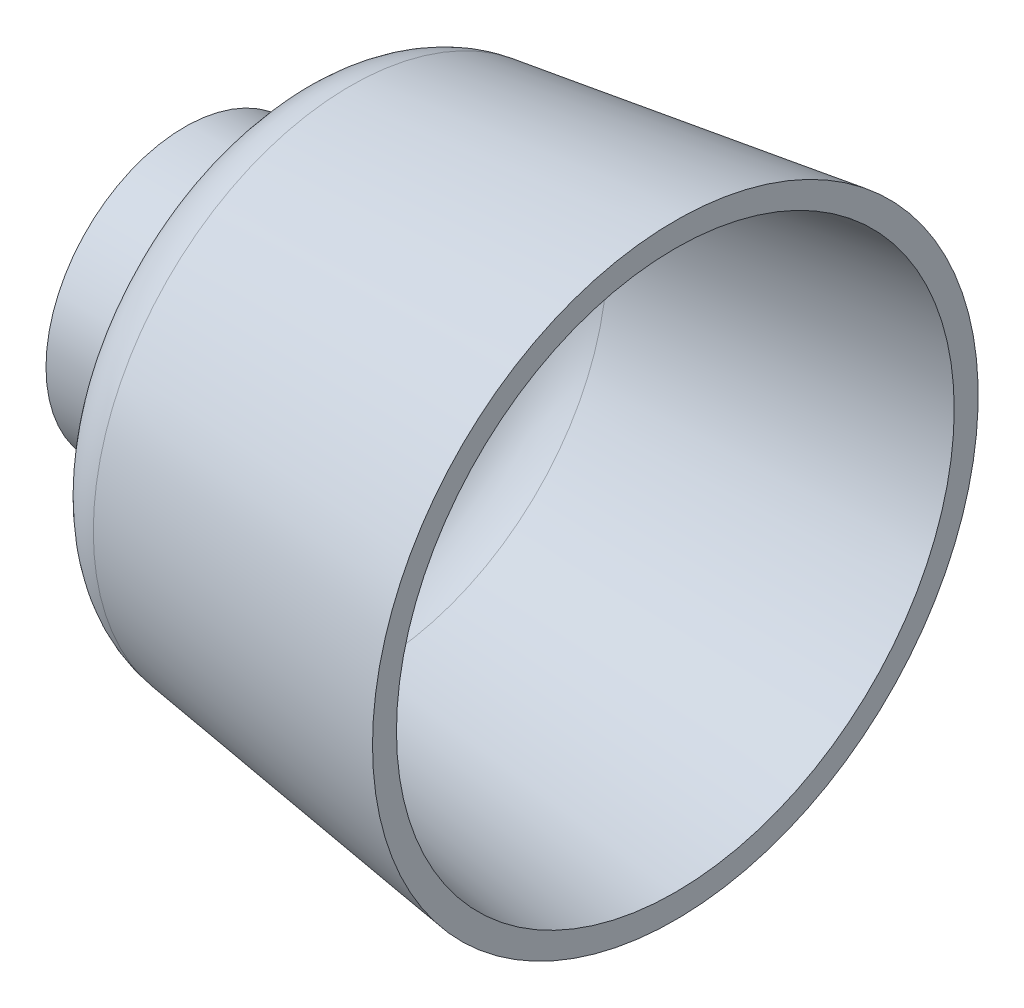
ISO-10303-21;
HEADER;
FILE_DESCRIPTION(('STEP AP214'),'2;1');
FILE_NAME('part.step','',(''),(''),'','','');
FILE_SCHEMA(('AUTOMOTIVE_DESIGN { 1 0 10303 214 1 1 1 1 }'));
ENDSEC;
DATA;
#1=APPLICATION_CONTEXT('core data for automotive mechanical design processes');
#2=APPLICATION_PROTOCOL_DEFINITION('international standard','automotive_design',2000,#1);
#3=PRODUCT_CONTEXT('',#1,'mechanical');
#4=PRODUCT('Part','Part','',(#3));
#5=PRODUCT_RELATED_PRODUCT_CATEGORY('part','',(#4));
#6=PRODUCT_DEFINITION_FORMATION('','',#4);
#7=PRODUCT_DEFINITION_CONTEXT('part definition',#1,'design');
#8=PRODUCT_DEFINITION('design','',#6,#7);
#9=PRODUCT_DEFINITION_SHAPE('','',#8);
#10=(LENGTH_UNIT() NAMED_UNIT(*) SI_UNIT(.MILLI.,.METRE.));
#11=(NAMED_UNIT(*) PLANE_ANGLE_UNIT() SI_UNIT($,.RADIAN.));
#12=(NAMED_UNIT(*) SI_UNIT($,.STERADIAN.) SOLID_ANGLE_UNIT());
#13=UNCERTAINTY_MEASURE_WITH_UNIT(LENGTH_MEASURE(1.E-05),#10,'distance_accuracy_value','');
#14=(GEOMETRIC_REPRESENTATION_CONTEXT(3) GLOBAL_UNCERTAINTY_ASSIGNED_CONTEXT((#13)) GLOBAL_UNIT_ASSIGNED_CONTEXT((#10,
#11,#12)) REPRESENTATION_CONTEXT('',''));
#15=CARTESIAN_POINT('',(0.,0.,0.));
#16=DIRECTION('',(0.,0.,1.));
#17=DIRECTION('',(1.,0.,0.));
#18=AXIS2_PLACEMENT_3D('',#15,#16,#17);
#19=CARTESIAN_POINT('',(7.68207066449393,0.,0.));
#20=DIRECTION('',(-1.,0.,0.));
#21=DIRECTION('',(0.,0.,1.));
#22=AXIS2_PLACEMENT_3D('',#19,#20,#21);
#23=PLANE('',#22);
#24=CARTESIAN_POINT('',(7.68207066449393,0.,0.));
#25=DIRECTION('',(-1.,0.,0.));
#26=DIRECTION('',(0.,0.,1.));
#27=AXIS2_PLACEMENT_3D('',#24,#25,#26);
#28=CIRCLE('',#27,7.34186999999999);
#29=CARTESIAN_POINT('',(7.68207066449393,0.,7.34186999999999));
#30=VERTEX_POINT('',#29);
#31=EDGE_CURVE('E69',#30,#30,#28,.T.);
#32=ORIENTED_EDGE('',*,*,#31,.T.);
#33=EDGE_LOOP('',(#32));
#34=FACE_BOUND('',#33,.T.);
#35=CARTESIAN_POINT('',(7.68207066449394,0.,0.));
#36=DIRECTION('',(-1.,0.,0.));
#37=DIRECTION('',(0.,0.,1.));
#38=AXIS2_PLACEMENT_3D('',#35,#36,#37);
#39=CIRCLE('',#38,7.68858);
#40=CARTESIAN_POINT('',(7.68207066449394,0.,7.68858));
#41=VERTEX_POINT('',#40);
#42=EDGE_CURVE('E54',#41,#41,#39,.T.);
#43=ORIENTED_EDGE('',*,*,#42,.F.);
#44=EDGE_LOOP('',(#43));
#45=FACE_BOUND('',#44,.T.);
#46=ADVANCED_FACE('F34',(#34,#45),#23,.F.);
#47=CARTESIAN_POINT('',(7.68207066449394,0.,0.));
#48=DIRECTION('',(1.,0.,0.));
#49=DIRECTION('',(0.,0.,-1.));
#50=AXIS2_PLACEMENT_3D('',#47,#48,#49);
#51=CONICAL_SURFACE('',#50,7.68858,1.39626340159547);
#52=CARTESIAN_POINT('',(8.42483198923574,0.,0.));
#53=DIRECTION('',(1.,0.,0.));
#54=DIRECTION('',(0.,0.,-1.));
#55=AXIS2_PLACEMENT_3D('',#52,#53,#54);
#56=CIRCLE('',#55,11.9009887973234);
#57=CARTESIAN_POINT('',(8.42483198923574,0.,-11.9009887973234));
#58=VERTEX_POINT('',#57);
#59=EDGE_CURVE('E45',#58,#58,#56,.T.);
#60=ORIENTED_EDGE('',*,*,#59,.T.);
#61=EDGE_LOOP('',(#60));
#62=FACE_BOUND('',#61,.T.);
#63=ORIENTED_EDGE('',*,*,#42,.T.);
#64=EDGE_LOOP('',(#63));
#65=FACE_BOUND('',#64,.T.);
#66=ADVANCED_FACE('F101',(#62,#65),#51,.F.);
#67=CARTESIAN_POINT('',(9.02568225749241,0.,0.));
#68=DIRECTION('',(1.,0.,0.));
#69=DIRECTION('',(0.,0.,-1.));
#70=AXIS2_PLACEMENT_3D('',#67,#68,#69);
#71=CONICAL_SURFACE('',#70,15.30858,0.139626340159547);
#72=CARTESIAN_POINT('',(12.4521670196341,0.,0.));
#73=DIRECTION('',(1.,0.,0.));
#74=DIRECTION('',(0.,0.,-1.));
#75=AXIS2_PLACEMENT_3D('',#72,#73,#74);
#76=CIRCLE('',#75,15.7901410285664);
#77=CARTESIAN_POINT('',(12.4521670196341,0.,-15.7901410285664));
#78=VERTEX_POINT('',#77);
#79=EDGE_CURVE('E49',#78,#78,#76,.F.);
#80=ORIENTED_EDGE('',*,*,#79,.T.);
#81=EDGE_LOOP('',(#80));
#82=FACE_BOUND('',#81,.T.);
#83=CARTESIAN_POINT('',(32.8153923183736,0.,0.));
#84=DIRECTION('',(-1.,0.,0.));
#85=DIRECTION('',(0.,0.,1.));
#86=AXIS2_PLACEMENT_3D('',#83,#84,#85);
#87=CIRCLE('',#86,18.6520057092841);
#88=CARTESIAN_POINT('',(32.8153923183736,0.,18.6520057092841));
#89=VERTEX_POINT('',#88);
#90=EDGE_CURVE('E57',#89,#89,#87,.T.);
#91=ORIENTED_EDGE('',*,*,#90,.F.);
#92=EDGE_LOOP('',(#91));
#93=FACE_BOUND('',#92,.T.);
#94=ADVANCED_FACE('F107',(#82,#93),#71,.F.);
#95=CARTESIAN_POINT('',(32.8153923183736,20.2551069806574,0.));
#96=DIRECTION('',(-1.,0.,0.));
#97=DIRECTION('',(0.,0.,1.));
#98=AXIS2_PLACEMENT_3D('',#95,#96,#97);
#99=PLANE('',#98);
#100=CARTESIAN_POINT('',(32.8153923183736,0.,0.));
#101=DIRECTION('',(-1.,0.,0.));
#102=DIRECTION('',(0.,0.,1.));
#103=AXIS2_PLACEMENT_3D('',#100,#101,#102);
#104=CIRCLE('',#103,20.2551069806574);
#105=CARTESIAN_POINT('',(32.8153923183736,0.,20.2551069806574));
#106=VERTEX_POINT('',#105);
#107=EDGE_CURVE('E60',#106,#106,#104,.T.);
#108=ORIENTED_EDGE('',*,*,#107,.F.);
#109=EDGE_LOOP('',(#108));
#110=FACE_BOUND('',#109,.T.);
#111=ORIENTED_EDGE('',*,*,#90,.T.);
#112=EDGE_LOOP('',(#111));
#113=FACE_BOUND('',#112,.T.);
#114=ADVANCED_FACE('F98',(#110,#113),#99,.F.);
#115=CARTESIAN_POINT('',(32.8153923183736,0.,0.));
#116=DIRECTION('',(1.,0.,0.));
#117=DIRECTION('',(0.,0.,-1.));
#118=AXIS2_PLACEMENT_3D('',#115,#116,#117);
#119=CONICAL_SURFACE('',#118,20.2551069806574,0.139626340159547);
#120=CARTESIAN_POINT('',(11.0890681344794,0.,0.));
#121=DIRECTION('',(-1.,0.,0.));
#122=DIRECTION('',(0.,0.,1.));
#123=AXIS2_PLACEMENT_3D('',#120,#121,#122);
#124=CIRCLE('',#123,17.2016712448382);
#125=CARTESIAN_POINT('',(11.0890681344794,0.,17.2016712448382));
#126=VERTEX_POINT('',#125);
#127=EDGE_CURVE('E10',#126,#126,#124,.F.);
#128=ORIENTED_EDGE('',*,*,#127,.T.);
#129=EDGE_LOOP('',(#128));
#130=FACE_BOUND('',#129,.T.);
#131=ORIENTED_EDGE('',*,*,#107,.T.);
#132=EDGE_LOOP('',(#131));
#133=FACE_BOUND('',#132,.T.);
#134=ADVANCED_FACE('F93',(#130,#133),#119,.T.);
#135=CARTESIAN_POINT('',(7.66258337233776,0.,0.));
#136=DIRECTION('',(1.,0.,0.));
#137=DIRECTION('',(0.,0.,-1.));
#138=AXIS2_PLACEMENT_3D('',#135,#136,#137);
#139=CONICAL_SURFACE('',#138,16.7201102162718,1.39626340159547);
#140=CARTESIAN_POINT('',(7.06173310408108,0.,0.));
#141=DIRECTION('',(-1.,0.,0.));
#142=DIRECTION('',(0.,0.,1.));
#143=AXIS2_PLACEMENT_3D('',#140,#141,#142);
#144=CIRCLE('',#143,13.3125190135952);
#145=CARTESIAN_POINT('',(7.06173310408108,0.,13.3125190135952));
#146=VERTEX_POINT('',#145);
#147=EDGE_CURVE('E41',#146,#146,#144,.T.);
#148=ORIENTED_EDGE('',*,*,#147,.T.);
#149=EDGE_LOOP('',(#148));
#150=FACE_BOUND('',#149,.T.);
#151=CARTESIAN_POINT('',(6.35,0.,0.));
#152=DIRECTION('',(-1.,0.,0.));
#153=DIRECTION('',(0.,0.,1.));
#154=AXIS2_PLACEMENT_3D('',#151,#152,#153);
#155=CIRCLE('',#154,9.27608);
#156=CARTESIAN_POINT('',(6.35,0.,9.27608));
#157=VERTEX_POINT('',#156);
#158=EDGE_CURVE('E63',#157,#157,#155,.T.);
#159=ORIENTED_EDGE('',*,*,#158,.F.);
#160=EDGE_LOOP('',(#159));
#161=FACE_BOUND('',#160,.T.);
#162=ADVANCED_FACE('F88',(#150,#161),#139,.T.);
#163=CARTESIAN_POINT('',(0.,0.,0.));
#164=DIRECTION('',(-1.,0.,0.));
#165=DIRECTION('',(0.,0.,1.));
#166=AXIS2_PLACEMENT_3D('',#163,#164,#165);
#167=CYLINDRICAL_SURFACE('',#166,9.27608);
#168=CARTESIAN_POINT('',(0.,0.,0.));
#169=DIRECTION('',(-1.,0.,0.));
#170=DIRECTION('',(0.,0.,1.));
#171=AXIS2_PLACEMENT_3D('',#168,#169,#170);
#172=CIRCLE('',#171,9.27608);
#173=CARTESIAN_POINT('',(0.,0.,9.27608));
#174=VERTEX_POINT('',#173);
#175=EDGE_CURVE('E66',#174,#174,#172,.T.);
#176=ORIENTED_EDGE('',*,*,#175,.F.);
#177=EDGE_LOOP('',(#176));
#178=FACE_BOUND('',#177,.T.);
#179=ORIENTED_EDGE('',*,*,#158,.T.);
#180=EDGE_LOOP('',(#179));
#181=FACE_BOUND('',#180,.T.);
#182=ADVANCED_FACE('F82',(#178,#181),#167,.T.);
#183=CARTESIAN_POINT('',(0.,7.68858,0.));
#184=DIRECTION('',(1.,0.,0.));
#185=DIRECTION('',(0.,0.,-1.));
#186=AXIS2_PLACEMENT_3D('',#183,#184,#185);
#187=PLANE('',#186);
#188=CARTESIAN_POINT('',(0.,0.,0.));
#189=DIRECTION('',(-1.,0.,0.));
#190=DIRECTION('',(0.,0.,1.));
#191=AXIS2_PLACEMENT_3D('',#188,#189,#190);
#192=CIRCLE('',#191,7.34186999999999);
#193=CARTESIAN_POINT('',(0.,0.,7.34186999999999));
#194=VERTEX_POINT('',#193);
#195=EDGE_CURVE('E72',#194,#194,#192,.T.);
#196=ORIENTED_EDGE('',*,*,#195,.F.);
#197=EDGE_LOOP('',(#196));
#198=FACE_BOUND('',#197,.T.);
#199=ORIENTED_EDGE('',*,*,#175,.T.);
#200=EDGE_LOOP('',(#199));
#201=FACE_BOUND('',#200,.T.);
#202=ADVANCED_FACE('F79',(#198,#201),#187,.F.);
#203=CARTESIAN_POINT('',(0.,0.,0.));
#204=DIRECTION('',(-1.,0.,0.));
#205=DIRECTION('',(0.,0.,1.));
#206=AXIS2_PLACEMENT_3D('',#203,#204,#205);
#207=CYLINDRICAL_SURFACE('',#206,7.34186999999999);
#208=ORIENTED_EDGE('',*,*,#195,.T.);
#209=EDGE_LOOP('',(#208));
#210=FACE_BOUND('',#209,.T.);
#211=ORIENTED_EDGE('',*,*,#31,.F.);
#212=EDGE_LOOP('',(#211));
#213=FACE_BOUND('',#212,.T.);
#214=ADVANCED_FACE('F76',(#210,#213),#207,.F.);
#215=CARTESIAN_POINT('',(13.1149789129564,0.,0.));
#216=DIRECTION('',(-1.,0.,0.));
#217=DIRECTION('',(0.,0.,1.));
#218=AXIS2_PLACEMENT_3D('',#215,#216,#217);
#219=TOROIDAL_SURFACE('',#218,11.0739893511847,4.7625);
#220=ORIENTED_EDGE('',*,*,#59,.F.);
#221=EDGE_LOOP('',(#220));
#222=FACE_BOUND('',#221,.T.);
#223=ORIENTED_EDGE('',*,*,#79,.F.);
#224=EDGE_LOOP('',(#223));
#225=FACE_BOUND('',#224,.T.);
#226=ADVANCED_FACE('F112',(#222,#225),#219,.F.);
#227=CARTESIAN_POINT('',(11.7518800278017,0.,0.));
#228=DIRECTION('',(1.,0.,0.));
#229=DIRECTION('',(0.,0.,-1.));
#230=AXIS2_PLACEMENT_3D('',#227,#228,#229);
#231=TOROIDAL_SURFACE('',#230,12.4855195674565,4.7625);
#232=ORIENTED_EDGE('',*,*,#127,.F.);
#233=EDGE_LOOP('',(#232));
#234=FACE_BOUND('',#233,.T.);
#235=ORIENTED_EDGE('',*,*,#147,.F.);
#236=EDGE_LOOP('',(#235));
#237=FACE_BOUND('',#236,.T.);
#238=ADVANCED_FACE('F36',(#234,#237),#231,.T.);
#239=CLOSED_SHELL('',(#46,#66,#94,#114,#134,#162,#182,#202,#214,#226,#238));
#240=MANIFOLD_SOLID_BREP('B2',#239);
#241=ADVANCED_BREP_SHAPE_REPRESENTATION('',(#18,#240),#14);
#242=SHAPE_DEFINITION_REPRESENTATION(#9,#241);
ENDSEC;
END-ISO-10303-21;
